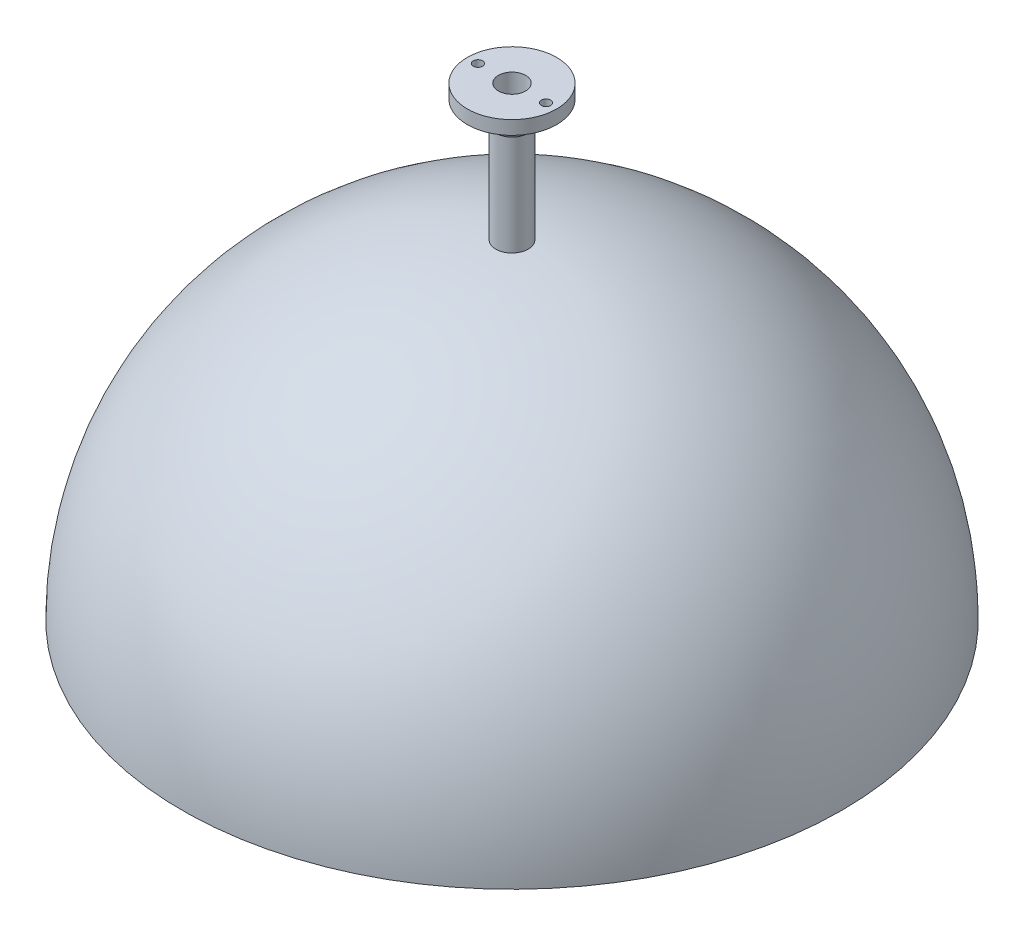
ISO-10303-21;
HEADER;
FILE_DESCRIPTION(('STEP AP214'),'2;1');
FILE_NAME('part.step','',(''),(''),'','','');
FILE_SCHEMA(('AUTOMOTIVE_DESIGN { 1 0 10303 214 1 1 1 1 }'));
ENDSEC;
DATA;
#1=APPLICATION_CONTEXT('core data for automotive mechanical design processes');
#2=APPLICATION_PROTOCOL_DEFINITION('international standard','automotive_design',2000,#1);
#3=PRODUCT_CONTEXT('',#1,'mechanical');
#4=PRODUCT('Part','Part','',(#3));
#5=PRODUCT_RELATED_PRODUCT_CATEGORY('part','',(#4));
#6=PRODUCT_DEFINITION_FORMATION('','',#4);
#7=PRODUCT_DEFINITION_CONTEXT('part definition',#1,'design');
#8=PRODUCT_DEFINITION('design','',#6,#7);
#9=PRODUCT_DEFINITION_SHAPE('','',#8);
#10=(LENGTH_UNIT() NAMED_UNIT(*) SI_UNIT(.MILLI.,.METRE.));
#11=(NAMED_UNIT(*) PLANE_ANGLE_UNIT() SI_UNIT($,.RADIAN.));
#12=(NAMED_UNIT(*) SI_UNIT($,.STERADIAN.) SOLID_ANGLE_UNIT());
#13=UNCERTAINTY_MEASURE_WITH_UNIT(LENGTH_MEASURE(1.E-05),#10,'distance_accuracy_value','');
#14=(GEOMETRIC_REPRESENTATION_CONTEXT(3) GLOBAL_UNCERTAINTY_ASSIGNED_CONTEXT((#13)) GLOBAL_UNIT_ASSIGNED_CONTEXT((#10,
#11,#12)) REPRESENTATION_CONTEXT('',''));
#15=CARTESIAN_POINT('',(0.,0.,0.));
#16=DIRECTION('',(0.,0.,1.));
#17=DIRECTION('',(1.,0.,0.));
#18=AXIS2_PLACEMENT_3D('',#15,#16,#17);
#19=CARTESIAN_POINT('',(0.,0.,0.));
#20=DIRECTION('',(0.,-1.,0.));
#21=DIRECTION('',(1.,0.,0.));
#22=AXIS2_PLACEMENT_3D('',#19,#20,#21);
#23=SPHERICAL_SURFACE('',#22,775.);
#24=CARTESIAN_POINT('',(-1.15513955451577E-13,774.067826485509,0.));
#25=DIRECTION('',(0.,-1.,0.));
#26=DIRECTION('',(1.,0.,0.));
#27=AXIS2_PLACEMENT_3D('',#24,#25,#26);
#28=CIRCLE('',#27,38.);
#29=CARTESIAN_POINT('',(37.9999999999999,774.067826485509,0.));
#30=VERTEX_POINT('',#29);
#31=EDGE_CURVE('E10',#30,#30,#28,.F.);
#32=ORIENTED_EDGE('',*,*,#31,.F.);
#33=EDGE_LOOP('',(#32));
#34=FACE_BOUND('',#33,.T.);
#35=CARTESIAN_POINT('',(0.,0.,0.));
#36=DIRECTION('',(0.,-1.,0.));
#37=DIRECTION('',(0.,0.,-1.));
#38=AXIS2_PLACEMENT_3D('',#35,#36,#37);
#39=CIRCLE('',#38,775.);
#40=CARTESIAN_POINT('',(0.,0.,-775.));
#41=VERTEX_POINT('',#40);
#42=EDGE_CURVE('E48',#41,#41,#39,.T.);
#43=ORIENTED_EDGE('',*,*,#42,.F.);
#44=EDGE_LOOP('',(#43));
#45=FACE_BOUND('',#44,.T.);
#46=ADVANCED_FACE('F41',(#34,#45),#23,.T.);
#47=CARTESIAN_POINT('',(759.,0.,0.));
#48=DIRECTION('',(0.,-1.,0.));
#49=DIRECTION('',(0.,0.,-1.));
#50=AXIS2_PLACEMENT_3D('',#47,#48,#49);
#51=PLANE('',#50);
#52=ORIENTED_EDGE('',*,*,#42,.T.);
#53=EDGE_LOOP('',(#52));
#54=FACE_BOUND('',#53,.T.);
#55=CARTESIAN_POINT('',(0.,0.,0.));
#56=DIRECTION('',(0.,-1.,0.));
#57=DIRECTION('',(0.,0.,-1.));
#58=AXIS2_PLACEMENT_3D('',#55,#56,#57);
#59=CIRCLE('',#58,759.);
#60=CARTESIAN_POINT('',(0.,0.,-759.));
#61=VERTEX_POINT('',#60);
#62=EDGE_CURVE('E53',#61,#61,#59,.T.);
#63=ORIENTED_EDGE('',*,*,#62,.F.);
#64=EDGE_LOOP('',(#63));
#65=FACE_BOUND('',#64,.T.);
#66=ADVANCED_FACE('F107',(#54,#65),#51,.T.);
#67=CARTESIAN_POINT('',(0.,0.,0.));
#68=DIRECTION('',(0.,-1.,0.));
#69=DIRECTION('',(1.,0.,0.));
#70=AXIS2_PLACEMENT_3D('',#67,#68,#69);
#71=SPHERICAL_SURFACE('',#70,759.);
#72=CARTESIAN_POINT('',(-1.13164676369366E-13,758.325128160738,0.));
#73=DIRECTION('',(0.,-1.,0.));
#74=DIRECTION('',(1.,0.,0.));
#75=AXIS2_PLACEMENT_3D('',#72,#73,#74);
#76=CIRCLE('',#75,32.0000000000001);
#77=CARTESIAN_POINT('',(32.,758.325128160738,0.));
#78=VERTEX_POINT('',#77);
#79=EDGE_CURVE('E86',#78,#78,#76,.T.);
#80=ORIENTED_EDGE('',*,*,#79,.F.);
#81=EDGE_LOOP('',(#80));
#82=FACE_BOUND('',#81,.T.);
#83=ORIENTED_EDGE('',*,*,#62,.T.);
#84=EDGE_LOOP('',(#83));
#85=FACE_BOUND('',#84,.T.);
#86=ADVANCED_FACE('F103',(#82,#85),#71,.F.);
#87=CARTESIAN_POINT('',(32.,1093.,0.));
#88=DIRECTION('',(0.,1.,0.));
#89=DIRECTION('',(-1.,0.,0.));
#90=AXIS2_PLACEMENT_3D('',#87,#88,#89);
#91=PLANE('',#90);
#92=CARTESIAN_POINT('',(-80.0000000000002,1093.,0.));
#93=DIRECTION('',(0.,1.,0.));
#94=DIRECTION('',(-1.,0.,0.));
#95=AXIS2_PLACEMENT_3D('',#92,#93,#94);
#96=CIRCLE('',#95,11.);
#97=CARTESIAN_POINT('',(-91.0000000000002,1093.,0.));
#98=VERTEX_POINT('',#97);
#99=EDGE_CURVE('E80',#98,#98,#96,.T.);
#100=ORIENTED_EDGE('',*,*,#99,.F.);
#101=EDGE_LOOP('',(#100));
#102=FACE_BOUND('',#101,.T.);
#103=CARTESIAN_POINT('',(79.9999999999998,1093.,0.));
#104=DIRECTION('',(0.,1.,0.));
#105=DIRECTION('',(-1.,0.,0.));
#106=AXIS2_PLACEMENT_3D('',#103,#104,#105);
#107=CIRCLE('',#106,11.);
#108=CARTESIAN_POINT('',(68.9999999999998,1093.,0.));
#109=VERTEX_POINT('',#108);
#110=EDGE_CURVE('E81',#109,#109,#107,.T.);
#111=ORIENTED_EDGE('',*,*,#110,.F.);
#112=EDGE_LOOP('',(#111));
#113=FACE_BOUND('',#112,.T.);
#114=CARTESIAN_POINT('',(0.,1093.,0.));
#115=DIRECTION('',(0.,-1.,0.));
#116=DIRECTION('',(1.,0.,0.));
#117=AXIS2_PLACEMENT_3D('',#114,#115,#116);
#118=CIRCLE('',#117,32.);
#119=CARTESIAN_POINT('',(32.,1093.,0.));
#120=VERTEX_POINT('',#119);
#121=EDGE_CURVE('E76',#120,#120,#118,.T.);
#122=ORIENTED_EDGE('',*,*,#121,.T.);
#123=EDGE_LOOP('',(#122));
#124=FACE_BOUND('',#123,.T.);
#125=CARTESIAN_POINT('',(0.,1093.,0.));
#126=DIRECTION('',(0.,-1.,0.));
#127=DIRECTION('',(1.,0.,0.));
#128=AXIS2_PLACEMENT_3D('',#125,#126,#127);
#129=CIRCLE('',#128,105.);
#130=CARTESIAN_POINT('',(105.,1093.,0.));
#131=VERTEX_POINT('',#130);
#132=EDGE_CURVE('E58',#131,#131,#129,.T.);
#133=ORIENTED_EDGE('',*,*,#132,.F.);
#134=EDGE_LOOP('',(#133));
#135=FACE_BOUND('',#134,.T.);
#136=ADVANCED_FACE('F106',(#102,#113,#124,#135),#91,.T.);
#137=CARTESIAN_POINT('',(0.,775.,0.));
#138=DIRECTION('',(0.,-1.,0.));
#139=DIRECTION('',(1.,0.,0.));
#140=AXIS2_PLACEMENT_3D('',#137,#138,#139);
#141=CYLINDRICAL_SURFACE('',#140,105.);
#142=ORIENTED_EDGE('',*,*,#132,.T.);
#143=EDGE_LOOP('',(#142));
#144=FACE_BOUND('',#143,.T.);
#145=CARTESIAN_POINT('',(0.,1061.,0.));
#146=DIRECTION('',(0.,-1.,0.));
#147=DIRECTION('',(1.,0.,0.));
#148=AXIS2_PLACEMENT_3D('',#145,#146,#147);
#149=CIRCLE('',#148,105.);
#150=CARTESIAN_POINT('',(105.,1061.,0.));
#151=VERTEX_POINT('',#150);
#152=EDGE_CURVE('E64',#151,#151,#149,.T.);
#153=ORIENTED_EDGE('',*,*,#152,.F.);
#154=EDGE_LOOP('',(#153));
#155=FACE_BOUND('',#154,.T.);
#156=ADVANCED_FACE('F119',(#144,#155),#141,.T.);
#157=CARTESIAN_POINT('',(52.624014673699,1061.,0.));
#158=DIRECTION('',(0.,-1.,0.));
#159=DIRECTION('',(1.,0.,0.));
#160=AXIS2_PLACEMENT_3D('',#157,#158,#159);
#161=PLANE('',#160);
#162=CARTESIAN_POINT('',(-80.0000000000002,1061.,0.));
#163=DIRECTION('',(0.,-1.,0.));
#164=DIRECTION('',(1.,0.,0.));
#165=AXIS2_PLACEMENT_3D('',#162,#163,#164);
#166=CIRCLE('',#165,11.);
#167=CARTESIAN_POINT('',(-69.0000000000002,1061.,0.));
#168=VERTEX_POINT('',#167);
#169=EDGE_CURVE('E90',#168,#168,#166,.F.);
#170=ORIENTED_EDGE('',*,*,#169,.T.);
#171=EDGE_LOOP('',(#170));
#172=FACE_BOUND('',#171,.T.);
#173=CARTESIAN_POINT('',(79.9999999999998,1061.,0.));
#174=DIRECTION('',(0.,-1.,0.));
#175=DIRECTION('',(1.,0.,0.));
#176=AXIS2_PLACEMENT_3D('',#173,#174,#175);
#177=CIRCLE('',#176,11.);
#178=CARTESIAN_POINT('',(90.9999999999998,1061.,0.));
#179=VERTEX_POINT('',#178);
#180=EDGE_CURVE('E85',#179,#179,#177,.F.);
#181=ORIENTED_EDGE('',*,*,#180,.T.);
#182=EDGE_LOOP('',(#181));
#183=FACE_BOUND('',#182,.T.);
#184=ORIENTED_EDGE('',*,*,#152,.T.);
#185=EDGE_LOOP('',(#184));
#186=FACE_BOUND('',#185,.T.);
#187=CARTESIAN_POINT('',(0.,1061.,0.));
#188=DIRECTION('',(0.,-1.,0.));
#189=DIRECTION('',(1.,0.,0.));
#190=AXIS2_PLACEMENT_3D('',#187,#188,#189);
#191=CIRCLE('',#190,52.624014673699);
#192=CARTESIAN_POINT('',(52.624014673699,1061.,0.));
#193=VERTEX_POINT('',#192);
#194=EDGE_CURVE('E68',#193,#193,#191,.T.);
#195=ORIENTED_EDGE('',*,*,#194,.F.);
#196=EDGE_LOOP('',(#195));
#197=FACE_BOUND('',#196,.T.);
#198=ADVANCED_FACE('F123',(#172,#183,#186,#197),#161,.T.);
#199=CARTESIAN_POINT('',(0.,1010.,0.));
#200=DIRECTION('',(0.,1.,0.));
#201=DIRECTION('',(-1.,0.,0.));
#202=AXIS2_PLACEMENT_3D('',#199,#200,#201);
#203=CONICAL_SURFACE('',#202,38.,0.279252680319089);
#204=ORIENTED_EDGE('',*,*,#194,.T.);
#205=EDGE_LOOP('',(#204));
#206=FACE_BOUND('',#205,.T.);
#207=CARTESIAN_POINT('',(0.,1010.,0.));
#208=DIRECTION('',(0.,-1.,0.));
#209=DIRECTION('',(1.,0.,0.));
#210=AXIS2_PLACEMENT_3D('',#207,#208,#209);
#211=CIRCLE('',#210,38.);
#212=CARTESIAN_POINT('',(38.,1010.,0.));
#213=VERTEX_POINT('',#212);
#214=EDGE_CURVE('E72',#213,#213,#211,.T.);
#215=ORIENTED_EDGE('',*,*,#214,.F.);
#216=EDGE_LOOP('',(#215));
#217=FACE_BOUND('',#216,.T.);
#218=ADVANCED_FACE('F127',(#206,#217),#203,.T.);
#219=CARTESIAN_POINT('',(0.,775.,0.));
#220=DIRECTION('',(0.,-1.,0.));
#221=DIRECTION('',(1.,0.,0.));
#222=AXIS2_PLACEMENT_3D('',#219,#220,#221);
#223=CYLINDRICAL_SURFACE('',#222,38.);
#224=ORIENTED_EDGE('',*,*,#214,.T.);
#225=EDGE_LOOP('',(#224));
#226=FACE_BOUND('',#225,.T.);
#227=ORIENTED_EDGE('',*,*,#31,.T.);
#228=EDGE_LOOP('',(#227));
#229=FACE_BOUND('',#228,.T.);
#230=ADVANCED_FACE('F131',(#226,#229),#223,.T.);
#231=CARTESIAN_POINT('',(0.,775.,0.));
#232=DIRECTION('',(0.,-1.,0.));
#233=DIRECTION('',(1.,0.,0.));
#234=AXIS2_PLACEMENT_3D('',#231,#232,#233);
#235=CYLINDRICAL_SURFACE('',#234,32.);
#236=ORIENTED_EDGE('',*,*,#121,.F.);
#237=EDGE_LOOP('',(#236));
#238=FACE_BOUND('',#237,.T.);
#239=ORIENTED_EDGE('',*,*,#79,.T.);
#240=EDGE_LOOP('',(#239));
#241=FACE_BOUND('',#240,.T.);
#242=ADVANCED_FACE('F101',(#238,#241),#235,.F.);
#243=CARTESIAN_POINT('',(80.,-0.00100000000013978,0.));
#244=DIRECTION('',(0.,1.,0.));
#245=DIRECTION('',(-1.,0.,0.));
#246=AXIS2_PLACEMENT_3D('',#243,#244,#245);
#247=CYLINDRICAL_SURFACE('',#246,11.);
#248=ORIENTED_EDGE('',*,*,#180,.F.);
#249=EDGE_LOOP('',(#248));
#250=FACE_BOUND('',#249,.T.);
#251=ORIENTED_EDGE('',*,*,#110,.T.);
#252=EDGE_LOOP('',(#251));
#253=FACE_BOUND('',#252,.T.);
#254=ADVANCED_FACE('F138',(#250,#253),#247,.F.);
#255=CARTESIAN_POINT('',(-80.,-0.00100000000013978,0.));
#256=DIRECTION('',(0.,1.,0.));
#257=DIRECTION('',(-1.,0.,0.));
#258=AXIS2_PLACEMENT_3D('',#255,#256,#257);
#259=CYLINDRICAL_SURFACE('',#258,11.);
#260=ORIENTED_EDGE('',*,*,#169,.F.);
#261=EDGE_LOOP('',(#260));
#262=FACE_BOUND('',#261,.T.);
#263=ORIENTED_EDGE('',*,*,#99,.T.);
#264=EDGE_LOOP('',(#263));
#265=FACE_BOUND('',#264,.T.);
#266=ADVANCED_FACE('F142',(#262,#265),#259,.F.);
#267=CLOSED_SHELL('',(#46,#66,#86,#136,#156,#198,#218,#230,#242,#254,#266));
#268=MANIFOLD_SOLID_BREP('B2',#267);
#269=ADVANCED_BREP_SHAPE_REPRESENTATION('',(#18,#268),#14);
#270=SHAPE_DEFINITION_REPRESENTATION(#9,#269);
ENDSEC;
END-ISO-10303-21;
